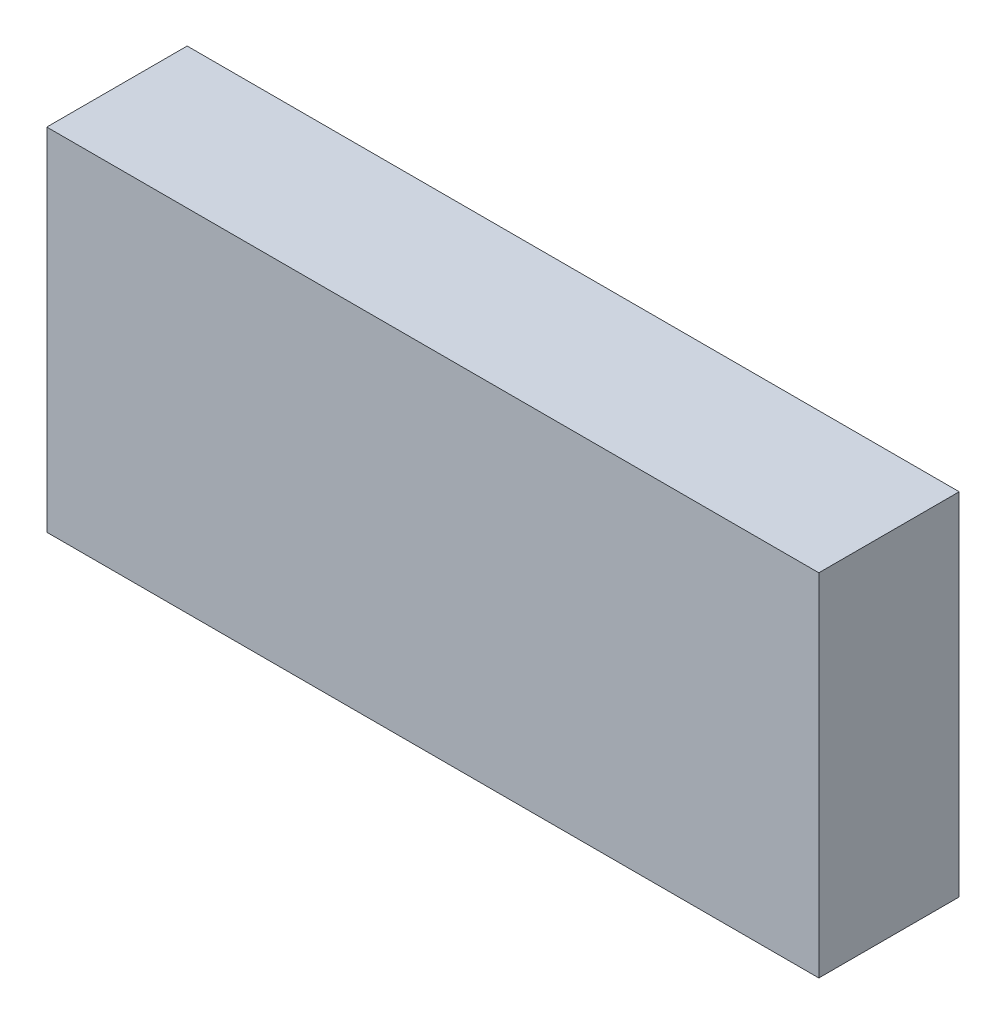
ISO-10303-21;
HEADER;
FILE_DESCRIPTION(('STEP AP214'),'2;1');
FILE_NAME('part.step','',(''),(''),'','','');
FILE_SCHEMA(('AUTOMOTIVE_DESIGN { 1 0 10303 214 1 1 1 1 }'));
ENDSEC;
DATA;
#1=APPLICATION_CONTEXT('core data for automotive mechanical design processes');
#2=APPLICATION_PROTOCOL_DEFINITION('international standard','automotive_design',2000,#1);
#3=PRODUCT_CONTEXT('',#1,'mechanical');
#4=PRODUCT('Part','Part','',(#3));
#5=PRODUCT_RELATED_PRODUCT_CATEGORY('part','',(#4));
#6=PRODUCT_DEFINITION_FORMATION('','',#4);
#7=PRODUCT_DEFINITION_CONTEXT('part definition',#1,'design');
#8=PRODUCT_DEFINITION('design','',#6,#7);
#9=PRODUCT_DEFINITION_SHAPE('','',#8);
#10=(LENGTH_UNIT() NAMED_UNIT(*) SI_UNIT(.MILLI.,.METRE.));
#11=(NAMED_UNIT(*) PLANE_ANGLE_UNIT() SI_UNIT($,.RADIAN.));
#12=(NAMED_UNIT(*) SI_UNIT($,.STERADIAN.) SOLID_ANGLE_UNIT());
#13=UNCERTAINTY_MEASURE_WITH_UNIT(LENGTH_MEASURE(1.E-05),#10,'distance_accuracy_value','');
#14=(GEOMETRIC_REPRESENTATION_CONTEXT(3) GLOBAL_UNCERTAINTY_ASSIGNED_CONTEXT((#13)) GLOBAL_UNIT_ASSIGNED_CONTEXT((#10,
#11,#12)) REPRESENTATION_CONTEXT('',''));
#15=CARTESIAN_POINT('',(0.,0.,0.));
#16=DIRECTION('',(0.,0.,1.));
#17=DIRECTION('',(1.,0.,0.));
#18=AXIS2_PLACEMENT_3D('',#15,#16,#17);
#19=CARTESIAN_POINT('',(-19.5,2.,-77.5));
#20=DIRECTION('',(0.,0.,1.));
#21=DIRECTION('',(1.,0.,0.));
#22=AXIS2_PLACEMENT_3D('',#19,#20,#21);
#23=PLANE('',#22);
#24=DIRECTION('',(0.,1.,0.));
#25=VECTOR('',#24,1.);
#26=CARTESIAN_POINT('',(5.5,0.,-77.5));
#27=LINE('',#26,#25);
#28=CARTESIAN_POINT('',(5.5,26.8,-77.5));
#29=VERTEX_POINT('',#28);
#30=CARTESIAN_POINT('',(5.5,31.8,-77.5));
#31=VERTEX_POINT('',#30);
#32=EDGE_CURVE('E87',#29,#31,#27,.T.);
#33=ORIENTED_EDGE('',*,*,#32,.F.);
#34=DIRECTION('',(-1.,0.,0.));
#35=VECTOR('',#34,1.);
#36=CARTESIAN_POINT('',(-5.5,26.8,-77.5));
#37=LINE('',#36,#35);
#38=CARTESIAN_POINT('',(-5.5,26.8,-77.5));
#39=VERTEX_POINT('',#38);
#40=EDGE_CURVE('E76',#29,#39,#37,.T.);
#41=ORIENTED_EDGE('',*,*,#40,.T.);
#42=DIRECTION('',(0.,1.,0.));
#43=VECTOR('',#42,1.);
#44=CARTESIAN_POINT('',(-5.5,0.,-77.5));
#45=LINE('',#44,#43);
#46=CARTESIAN_POINT('',(-5.5,31.8,-77.5));
#47=VERTEX_POINT('',#46);
#48=EDGE_CURVE('E59',#39,#47,#45,.T.);
#49=ORIENTED_EDGE('',*,*,#48,.T.);
#50=DIRECTION('',(-1.,0.,0.));
#51=VECTOR('',#50,1.);
#52=CARTESIAN_POINT('',(0.,31.8,-77.5));
#53=LINE('',#52,#51);
#54=EDGE_CURVE('E92',#31,#47,#53,.T.);
#55=ORIENTED_EDGE('',*,*,#54,.F.);
#56=EDGE_LOOP('',(#33,#41,#49,#55));
#57=FACE_BOUND('',#56,.T.);
#58=ADVANCED_FACE('F37',(#57),#23,.F.);
#59=CARTESIAN_POINT('',(5.5,0.,-77.5));
#60=DIRECTION('',(1.,0.,0.));
#61=DIRECTION('',(0.,0.,-1.));
#62=AXIS2_PLACEMENT_3D('',#59,#60,#61);
#63=PLANE('',#62);
#64=DIRECTION('',(0.,0.,1.));
#65=VECTOR('',#64,1.);
#66=CARTESIAN_POINT('',(5.5,26.8,-77.5));
#67=LINE('',#66,#65);
#68=CARTESIAN_POINT('',(5.5,26.8,-75.5));
#69=VERTEX_POINT('',#68);
#70=EDGE_CURVE('E51',#29,#69,#67,.T.);
#71=ORIENTED_EDGE('',*,*,#70,.F.);
#72=ORIENTED_EDGE('',*,*,#32,.T.);
#73=DIRECTION('',(0.,0.,1.));
#74=VECTOR('',#73,1.);
#75=CARTESIAN_POINT('',(5.5,31.8,-77.5));
#76=LINE('',#75,#74);
#77=CARTESIAN_POINT('',(5.5,31.8,-75.5));
#78=VERTEX_POINT('',#77);
#79=EDGE_CURVE('E93',#31,#78,#76,.T.);
#80=ORIENTED_EDGE('',*,*,#79,.T.);
#81=DIRECTION('',(0.,-1.,0.));
#82=VECTOR('',#81,1.);
#83=CARTESIAN_POINT('',(5.5,40.,-75.5));
#84=LINE('',#83,#82);
#85=EDGE_CURVE('E90',#78,#69,#84,.T.);
#86=ORIENTED_EDGE('',*,*,#85,.T.);
#87=EDGE_LOOP('',(#71,#72,#80,#86));
#88=FACE_BOUND('',#87,.T.);
#89=ADVANCED_FACE('F85',(#88),#63,.T.);
#90=CARTESIAN_POINT('',(-5.5,0.,-77.5));
#91=DIRECTION('',(1.,0.,0.));
#92=DIRECTION('',(0.,0.,-1.));
#93=AXIS2_PLACEMENT_3D('',#90,#91,#92);
#94=PLANE('',#93);
#95=ORIENTED_EDGE('',*,*,#48,.F.);
#96=DIRECTION('',(0.,0.,1.));
#97=VECTOR('',#96,1.);
#98=CARTESIAN_POINT('',(-5.5,26.8,-77.5));
#99=LINE('',#98,#97);
#100=CARTESIAN_POINT('',(-5.5,26.8,-75.5));
#101=VERTEX_POINT('',#100);
#102=EDGE_CURVE('E79',#39,#101,#99,.T.);
#103=ORIENTED_EDGE('',*,*,#102,.T.);
#104=DIRECTION('',(0.,-1.,0.));
#105=VECTOR('',#104,1.);
#106=CARTESIAN_POINT('',(-5.5,40.,-75.5));
#107=LINE('',#106,#105);
#108=CARTESIAN_POINT('',(-5.5,31.8,-75.5));
#109=VERTEX_POINT('',#108);
#110=EDGE_CURVE('E44',#109,#101,#107,.T.);
#111=ORIENTED_EDGE('',*,*,#110,.F.);
#112=DIRECTION('',(0.,0.,1.));
#113=VECTOR('',#112,1.);
#114=CARTESIAN_POINT('',(-5.5,31.8,-77.5));
#115=LINE('',#114,#113);
#116=EDGE_CURVE('E96',#47,#109,#115,.T.);
#117=ORIENTED_EDGE('',*,*,#116,.F.);
#118=EDGE_LOOP('',(#95,#103,#111,#117));
#119=FACE_BOUND('',#118,.T.);
#120=ADVANCED_FACE('F106',(#119),#94,.F.);
#121=CARTESIAN_POINT('',(0.,40.,-75.5));
#122=DIRECTION('',(0.,0.,-1.));
#123=DIRECTION('',(-1.,0.,0.));
#124=AXIS2_PLACEMENT_3D('',#121,#122,#123);
#125=PLANE('',#124);
#126=ORIENTED_EDGE('',*,*,#110,.T.);
#127=DIRECTION('',(-1.,0.,0.));
#128=VECTOR('',#127,1.);
#129=CARTESIAN_POINT('',(-5.5,26.8,-75.5));
#130=LINE('',#129,#128);
#131=EDGE_CURVE('E81',#69,#101,#130,.T.);
#132=ORIENTED_EDGE('',*,*,#131,.F.);
#133=ORIENTED_EDGE('',*,*,#85,.F.);
#134=DIRECTION('',(-1.,0.,0.));
#135=VECTOR('',#134,1.);
#136=CARTESIAN_POINT('',(21.9721359549996,31.8,-75.5));
#137=LINE('',#136,#135);
#138=EDGE_CURVE('E11',#78,#109,#137,.T.);
#139=ORIENTED_EDGE('',*,*,#138,.T.);
#140=EDGE_LOOP('',(#126,#132,#133,#139));
#141=FACE_BOUND('',#140,.T.);
#142=ADVANCED_FACE('F103',(#141),#125,.F.);
#143=CARTESIAN_POINT('',(0.,31.8,-77.5));
#144=DIRECTION('',(0.,1.,0.));
#145=DIRECTION('',(0.,0.,1.));
#146=AXIS2_PLACEMENT_3D('',#143,#144,#145);
#147=PLANE('',#146);
#148=ORIENTED_EDGE('',*,*,#138,.F.);
#149=ORIENTED_EDGE('',*,*,#79,.F.);
#150=ORIENTED_EDGE('',*,*,#54,.T.);
#151=ORIENTED_EDGE('',*,*,#116,.T.);
#152=EDGE_LOOP('',(#148,#149,#150,#151));
#153=FACE_BOUND('',#152,.T.);
#154=ADVANCED_FACE('F111',(#153),#147,.T.);
#155=CARTESIAN_POINT('',(-5.5,26.8,-77.5));
#156=DIRECTION('',(0.,1.,0.));
#157=DIRECTION('',(0.,0.,1.));
#158=AXIS2_PLACEMENT_3D('',#155,#156,#157);
#159=PLANE('',#158);
#160=ORIENTED_EDGE('',*,*,#131,.T.);
#161=ORIENTED_EDGE('',*,*,#102,.F.);
#162=ORIENTED_EDGE('',*,*,#40,.F.);
#163=ORIENTED_EDGE('',*,*,#70,.T.);
#164=EDGE_LOOP('',(#160,#161,#162,#163));
#165=FACE_BOUND('',#164,.T.);
#166=ADVANCED_FACE('F77',(#165),#159,.F.);
#167=CLOSED_SHELL('',(#58,#89,#120,#142,#154,#166));
#168=MANIFOLD_SOLID_BREP('B2',#167);
#169=ADVANCED_BREP_SHAPE_REPRESENTATION('',(#18,#168),#14);
#170=SHAPE_DEFINITION_REPRESENTATION(#9,#169);
ENDSEC;
END-ISO-10303-21;
